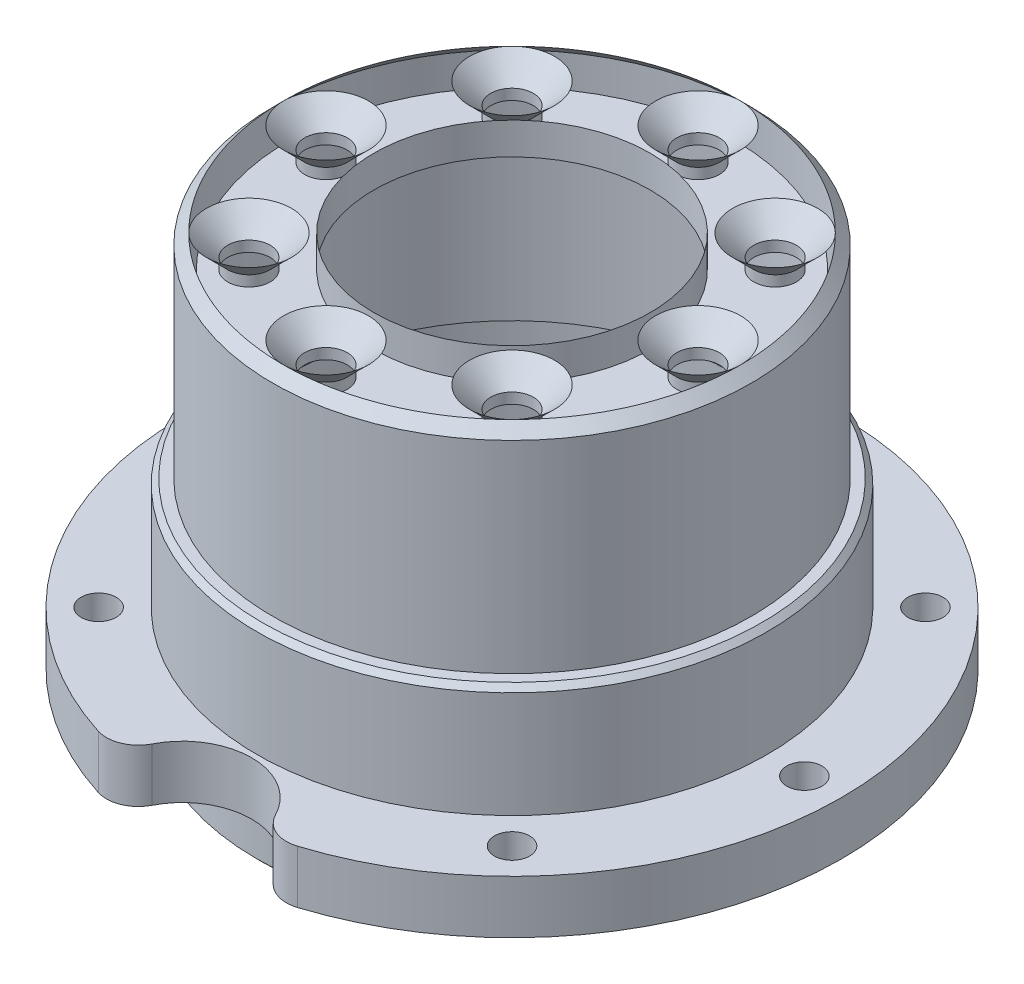
ISO-10303-21;
HEADER;
FILE_DESCRIPTION(('STEP AP214'),'2;1');
FILE_NAME('part.step','',(''),(''),'','','');
FILE_SCHEMA(('AUTOMOTIVE_DESIGN { 1 0 10303 214 1 1 1 1 }'));
ENDSEC;
DATA;
#1=APPLICATION_CONTEXT('core data for automotive mechanical design processes');
#2=APPLICATION_PROTOCOL_DEFINITION('international standard','automotive_design',2000,#1);
#3=PRODUCT_CONTEXT('',#1,'mechanical');
#4=PRODUCT('Part','Part','',(#3));
#5=PRODUCT_RELATED_PRODUCT_CATEGORY('part','',(#4));
#6=PRODUCT_DEFINITION_FORMATION('','',#4);
#7=PRODUCT_DEFINITION_CONTEXT('part definition',#1,'design');
#8=PRODUCT_DEFINITION('design','',#6,#7);
#9=PRODUCT_DEFINITION_SHAPE('','',#8);
#10=(LENGTH_UNIT() NAMED_UNIT(*) SI_UNIT(.MILLI.,.METRE.));
#11=(NAMED_UNIT(*) PLANE_ANGLE_UNIT() SI_UNIT($,.RADIAN.));
#12=(NAMED_UNIT(*) SI_UNIT($,.STERADIAN.) SOLID_ANGLE_UNIT());
#13=UNCERTAINTY_MEASURE_WITH_UNIT(LENGTH_MEASURE(1.E-05),#10,'distance_accuracy_value','');
#14=(GEOMETRIC_REPRESENTATION_CONTEXT(3) GLOBAL_UNCERTAINTY_ASSIGNED_CONTEXT((#13)) GLOBAL_UNIT_ASSIGNED_CONTEXT((#10,
#11,#12)) REPRESENTATION_CONTEXT('',''));
#15=CARTESIAN_POINT('',(0.,0.,0.));
#16=DIRECTION('',(0.,0.,1.));
#17=DIRECTION('',(1.,0.,0.));
#18=AXIS2_PLACEMENT_3D('',#15,#16,#17);
#19=CARTESIAN_POINT('',(-22.5,35.5,0.));
#20=DIRECTION('',(0.,-1.,0.));
#21=DIRECTION('',(0.,0.,-1.));
#22=AXIS2_PLACEMENT_3D('',#19,#20,#21);
#23=PLANE('',#22);
#24=CARTESIAN_POINT('',(0.,35.5,-17.5));
#25=DIRECTION('',(0.,1.,0.));
#26=DIRECTION('',(0.,0.,1.));
#27=AXIS2_PLACEMENT_3D('',#24,#25,#26);
#28=CIRCLE('',#27,4.);
#29=CARTESIAN_POINT('',(0.,35.5,-21.5));
#30=VERTEX_POINT('',#29);
#31=EDGE_CURVE('E111',#30,#30,#28,.T.);
#32=ORIENTED_EDGE('',*,*,#31,.F.);
#33=CARTESIAN_POINT('',(0.,35.5,0.));
#34=DIRECTION('',(0.,-1.,0.));
#35=DIRECTION('',(0.,0.,-1.));
#36=AXIS2_PLACEMENT_3D('',#33,#34,#35);
#37=CIRCLE('',#36,21.5);
#38=CARTESIAN_POINT('',(-15.2027957955108,35.5,-15.2027957955108));
#39=VERTEX_POINT('',#38);
#40=EDGE_CURVE('E293',#30,#39,#37,.F.);
#41=ORIENTED_EDGE('',*,*,#40,.T.);
#42=CARTESIAN_POINT('',(-12.3743686707646,35.5,-12.3743686707646));
#43=DIRECTION('',(0.,1.,0.));
#44=DIRECTION('',(0.,0.,1.));
#45=AXIS2_PLACEMENT_3D('',#42,#43,#44);
#46=CIRCLE('',#45,4.);
#47=EDGE_CURVE('E170',#39,#39,#46,.T.);
#48=ORIENTED_EDGE('',*,*,#47,.F.);
#49=CARTESIAN_POINT('',(0.,35.5,0.));
#50=DIRECTION('',(0.,-1.,0.));
#51=DIRECTION('',(0.,0.,-1.));
#52=AXIS2_PLACEMENT_3D('',#49,#50,#51);
#53=CIRCLE('',#52,21.5);
#54=CARTESIAN_POINT('',(-21.5,35.5,0.));
#55=VERTEX_POINT('',#54);
#56=EDGE_CURVE('E291',#39,#55,#53,.F.);
#57=ORIENTED_EDGE('',*,*,#56,.T.);
#58=CARTESIAN_POINT('',(-17.5,35.5,0.));
#59=DIRECTION('',(0.,1.,0.));
#60=DIRECTION('',(0.,0.,1.));
#61=AXIS2_PLACEMENT_3D('',#58,#59,#60);
#62=CIRCLE('',#61,4.);
#63=EDGE_CURVE('E163',#55,#55,#62,.T.);
#64=ORIENTED_EDGE('',*,*,#63,.F.);
#65=CARTESIAN_POINT('',(0.,35.5,0.));
#66=DIRECTION('',(0.,-1.,0.));
#67=DIRECTION('',(0.,0.,-1.));
#68=AXIS2_PLACEMENT_3D('',#65,#66,#67);
#69=CIRCLE('',#68,21.5);
#70=CARTESIAN_POINT('',(-15.2027957955108,35.5,15.2027957955108));
#71=VERTEX_POINT('',#70);
#72=EDGE_CURVE('E289',#55,#71,#69,.F.);
#73=ORIENTED_EDGE('',*,*,#72,.T.);
#74=CARTESIAN_POINT('',(-12.3743686707646,35.5,12.3743686707646));
#75=DIRECTION('',(0.,1.,0.));
#76=DIRECTION('',(0.,0.,1.));
#77=AXIS2_PLACEMENT_3D('',#74,#75,#76);
#78=CIRCLE('',#77,4.);
#79=EDGE_CURVE('E156',#71,#71,#78,.T.);
#80=ORIENTED_EDGE('',*,*,#79,.F.);
#81=CARTESIAN_POINT('',(0.,35.5,0.));
#82=DIRECTION('',(0.,-1.,0.));
#83=DIRECTION('',(0.,0.,-1.));
#84=AXIS2_PLACEMENT_3D('',#81,#82,#83);
#85=CIRCLE('',#84,21.5);
#86=CARTESIAN_POINT('',(0.,35.5,21.5));
#87=VERTEX_POINT('',#86);
#88=EDGE_CURVE('E287',#71,#87,#85,.F.);
#89=ORIENTED_EDGE('',*,*,#88,.T.);
#90=CARTESIAN_POINT('',(0.,35.5,17.5));
#91=DIRECTION('',(0.,1.,0.));
#92=DIRECTION('',(0.,0.,1.));
#93=AXIS2_PLACEMENT_3D('',#90,#91,#92);
#94=CIRCLE('',#93,4.);
#95=EDGE_CURVE('E149',#87,#87,#94,.T.);
#96=ORIENTED_EDGE('',*,*,#95,.F.);
#97=CARTESIAN_POINT('',(0.,35.5,0.));
#98=DIRECTION('',(0.,-1.,0.));
#99=DIRECTION('',(0.,0.,-1.));
#100=AXIS2_PLACEMENT_3D('',#97,#98,#99);
#101=CIRCLE('',#100,21.5);
#102=CARTESIAN_POINT('',(15.2027957955108,35.5,15.2027957955108));
#103=VERTEX_POINT('',#102);
#104=EDGE_CURVE('E285',#87,#103,#101,.F.);
#105=ORIENTED_EDGE('',*,*,#104,.T.);
#106=CARTESIAN_POINT('',(12.3743686707646,35.5,12.3743686707646));
#107=DIRECTION('',(0.,1.,0.));
#108=DIRECTION('',(0.,0.,1.));
#109=AXIS2_PLACEMENT_3D('',#106,#107,#108);
#110=CIRCLE('',#109,4.);
#111=EDGE_CURVE('E142',#103,#103,#110,.T.);
#112=ORIENTED_EDGE('',*,*,#111,.F.);
#113=CARTESIAN_POINT('',(0.,35.5,0.));
#114=DIRECTION('',(0.,-1.,0.));
#115=DIRECTION('',(0.,0.,-1.));
#116=AXIS2_PLACEMENT_3D('',#113,#114,#115);
#117=CIRCLE('',#116,21.5);
#118=CARTESIAN_POINT('',(21.5,35.5,0.));
#119=VERTEX_POINT('',#118);
#120=EDGE_CURVE('E283',#103,#119,#117,.F.);
#121=ORIENTED_EDGE('',*,*,#120,.T.);
#122=CARTESIAN_POINT('',(17.5,35.5,0.));
#123=DIRECTION('',(0.,1.,0.));
#124=DIRECTION('',(0.,0.,1.));
#125=AXIS2_PLACEMENT_3D('',#122,#123,#124);
#126=CIRCLE('',#125,4.);
#127=EDGE_CURVE('E135',#119,#119,#126,.T.);
#128=ORIENTED_EDGE('',*,*,#127,.F.);
#129=CARTESIAN_POINT('',(0.,35.5,0.));
#130=DIRECTION('',(0.,-1.,0.));
#131=DIRECTION('',(0.,0.,-1.));
#132=AXIS2_PLACEMENT_3D('',#129,#130,#131);
#133=CIRCLE('',#132,21.5);
#134=CARTESIAN_POINT('',(15.2027957955108,35.5,-15.2027957955108));
#135=VERTEX_POINT('',#134);
#136=EDGE_CURVE('E117',#119,#135,#133,.F.);
#137=ORIENTED_EDGE('',*,*,#136,.T.);
#138=CARTESIAN_POINT('',(12.3743686707646,35.5,-12.3743686707646));
#139=DIRECTION('',(0.,1.,0.));
#140=DIRECTION('',(0.,0.,1.));
#141=AXIS2_PLACEMENT_3D('',#138,#139,#140);
#142=CIRCLE('',#141,4.);
#143=EDGE_CURVE('E114',#135,#135,#142,.T.);
#144=ORIENTED_EDGE('',*,*,#143,.F.);
#145=CARTESIAN_POINT('',(0.,35.5,0.));
#146=DIRECTION('',(0.,-1.,0.));
#147=DIRECTION('',(0.,0.,-1.));
#148=AXIS2_PLACEMENT_3D('',#145,#146,#147);
#149=CIRCLE('',#148,21.5);
#150=EDGE_CURVE('E107',#135,#30,#149,.F.);
#151=ORIENTED_EDGE('',*,*,#150,.T.);
#152=EDGE_LOOP('',(#32,#41,#48,#57,#64,#73,#80,#89,#96,#105,#112,#121,#128,#137,#144,#151));
#153=FACE_BOUND('',#152,.T.);
#154=CARTESIAN_POINT('',(0.,35.5,0.));
#155=DIRECTION('',(0.,-1.,0.));
#156=DIRECTION('',(0.,0.,-1.));
#157=AXIS2_PLACEMENT_3D('',#154,#155,#156);
#158=CIRCLE('',#157,13.);
#159=CARTESIAN_POINT('',(0.,35.5,-13.));
#160=VERTEX_POINT('',#159);
#161=EDGE_CURVE('E243',#160,#160,#158,.T.);
#162=ORIENTED_EDGE('',*,*,#161,.T.);
#163=EDGE_LOOP('',(#162));
#164=FACE_BOUND('',#163,.T.);
#165=ADVANCED_FACE('F42',(#153,#164),#23,.F.);
#166=CARTESIAN_POINT('',(0.,0.,0.));
#167=DIRECTION('',(0.,-1.,0.));
#168=DIRECTION('',(0.,0.,-1.));
#169=AXIS2_PLACEMENT_3D('',#166,#167,#168);
#170=CYLINDRICAL_SURFACE('',#169,13.);
#171=ORIENTED_EDGE('',*,*,#161,.F.);
#172=EDGE_LOOP('',(#171));
#173=FACE_BOUND('',#172,.T.);
#174=CARTESIAN_POINT('',(0.,32.5,0.));
#175=DIRECTION('',(0.,-1.,0.));
#176=DIRECTION('',(0.,0.,-1.));
#177=AXIS2_PLACEMENT_3D('',#174,#175,#176);
#178=CIRCLE('',#177,13.);
#179=CARTESIAN_POINT('',(0.,32.5,-13.));
#180=VERTEX_POINT('',#179);
#181=EDGE_CURVE('E213',#180,#180,#178,.T.);
#182=ORIENTED_EDGE('',*,*,#181,.T.);
#183=EDGE_LOOP('',(#182));
#184=FACE_BOUND('',#183,.T.);
#185=ADVANCED_FACE('F335',(#173,#184),#170,.F.);
#186=CARTESIAN_POINT('',(0.,0.,0.));
#187=DIRECTION('',(0.,-1.,0.));
#188=DIRECTION('',(0.,0.,-1.));
#189=AXIS2_PLACEMENT_3D('',#186,#187,#188);
#190=CYLINDRICAL_SURFACE('',#189,22.5);
#191=CARTESIAN_POINT('',(0.,34.5,0.));
#192=DIRECTION('',(0.,-1.,0.));
#193=DIRECTION('',(0.,0.,-1.));
#194=AXIS2_PLACEMENT_3D('',#191,#192,#193);
#195=CIRCLE('',#194,22.5);
#196=CARTESIAN_POINT('',(0.,34.5,-22.5));
#197=VERTEX_POINT('',#196);
#198=EDGE_CURVE('E118',#197,#197,#195,.T.);
#199=ORIENTED_EDGE('',*,*,#198,.T.);
#200=EDGE_LOOP('',(#199));
#201=FACE_BOUND('',#200,.T.);
#202=CARTESIAN_POINT('',(0.,15.5,0.));
#203=DIRECTION('',(0.,-1.,0.));
#204=DIRECTION('',(0.,0.,-1.));
#205=AXIS2_PLACEMENT_3D('',#202,#203,#204);
#206=CIRCLE('',#205,22.5);
#207=CARTESIAN_POINT('',(0.,15.5,-22.5));
#208=VERTEX_POINT('',#207);
#209=EDGE_CURVE('E240',#208,#208,#206,.T.);
#210=ORIENTED_EDGE('',*,*,#209,.F.);
#211=EDGE_LOOP('',(#210));
#212=FACE_BOUND('',#211,.T.);
#213=ADVANCED_FACE('F340',(#201,#212),#190,.T.);
#214=CARTESIAN_POINT('',(-24.,15.5,0.));
#215=DIRECTION('',(0.,-1.,0.));
#216=DIRECTION('',(0.,0.,-1.));
#217=AXIS2_PLACEMENT_3D('',#214,#215,#216);
#218=PLANE('',#217);
#219=CARTESIAN_POINT('',(0.,15.5,0.));
#220=DIRECTION('',(0.,-1.,0.));
#221=DIRECTION('',(0.,0.,-1.));
#222=AXIS2_PLACEMENT_3D('',#219,#220,#221);
#223=CIRCLE('',#222,23.5);
#224=CARTESIAN_POINT('',(0.,15.5,-23.5));
#225=VERTEX_POINT('',#224);
#226=EDGE_CURVE('E277',#225,#225,#223,.F.);
#227=ORIENTED_EDGE('',*,*,#226,.T.);
#228=EDGE_LOOP('',(#227));
#229=FACE_BOUND('',#228,.T.);
#230=ORIENTED_EDGE('',*,*,#209,.T.);
#231=EDGE_LOOP('',(#230));
#232=FACE_BOUND('',#231,.T.);
#233=ADVANCED_FACE('F371',(#229,#232),#218,.F.);
#234=CARTESIAN_POINT('',(0.,0.,0.));
#235=DIRECTION('',(0.,-1.,0.));
#236=DIRECTION('',(0.,0.,-1.));
#237=AXIS2_PLACEMENT_3D('',#234,#235,#236);
#238=CYLINDRICAL_SURFACE('',#237,24.);
#239=CARTESIAN_POINT('',(0.,15.,0.));
#240=DIRECTION('',(0.,-1.,0.));
#241=DIRECTION('',(0.,0.,-1.));
#242=AXIS2_PLACEMENT_3D('',#239,#240,#241);
#243=CIRCLE('',#242,24.);
#244=CARTESIAN_POINT('',(0.,15.,-24.));
#245=VERTEX_POINT('',#244);
#246=EDGE_CURVE('E274',#245,#245,#243,.T.);
#247=ORIENTED_EDGE('',*,*,#246,.T.);
#248=EDGE_LOOP('',(#247));
#249=FACE_BOUND('',#248,.T.);
#250=CARTESIAN_POINT('',(0.,5.,0.));
#251=DIRECTION('',(0.,-1.,0.));
#252=DIRECTION('',(0.,0.,-1.));
#253=AXIS2_PLACEMENT_3D('',#250,#251,#252);
#254=CIRCLE('',#253,24.);
#255=CARTESIAN_POINT('',(0.,5.,-24.));
#256=VERTEX_POINT('',#255);
#257=EDGE_CURVE('E237',#256,#256,#254,.T.);
#258=ORIENTED_EDGE('',*,*,#257,.F.);
#259=EDGE_LOOP('',(#258));
#260=FACE_BOUND('',#259,.T.);
#261=ADVANCED_FACE('F375',(#249,#260),#238,.T.);
#262=CARTESIAN_POINT('',(-31.,5.,0.));
#263=DIRECTION('',(0.,-1.,0.));
#264=DIRECTION('',(0.,0.,-1.));
#265=AXIS2_PLACEMENT_3D('',#262,#263,#264);
#266=PLANE('',#265);
#267=CARTESIAN_POINT('',(-19.4454364826301,5.,-19.4454364826301));
#268=DIRECTION('',(0.,1.,0.));
#269=DIRECTION('',(0.,0.,1.));
#270=AXIS2_PLACEMENT_3D('',#267,#268,#269);
#271=CIRCLE('',#270,1.64999999999999);
#272=CARTESIAN_POINT('',(-19.4454364826301,5.,-17.7954364826301));
#273=VERTEX_POINT('',#272);
#274=EDGE_CURVE('E177',#273,#273,#271,.T.);
#275=ORIENTED_EDGE('',*,*,#274,.F.);
#276=EDGE_LOOP('',(#275));
#277=FACE_BOUND('',#276,.T.);
#278=CARTESIAN_POINT('',(0.,5.,-27.5));
#279=DIRECTION('',(0.,1.,0.));
#280=DIRECTION('',(0.,0.,1.));
#281=AXIS2_PLACEMENT_3D('',#278,#279,#280);
#282=CIRCLE('',#281,1.64999999999999);
#283=CARTESIAN_POINT('',(0.,5.,-25.85));
#284=VERTEX_POINT('',#283);
#285=EDGE_CURVE('E181',#284,#284,#282,.T.);
#286=ORIENTED_EDGE('',*,*,#285,.F.);
#287=EDGE_LOOP('',(#286));
#288=FACE_BOUND('',#287,.T.);
#289=CARTESIAN_POINT('',(19.4454364826301,5.,-19.4454364826301));
#290=DIRECTION('',(0.,1.,0.));
#291=DIRECTION('',(0.,0.,1.));
#292=AXIS2_PLACEMENT_3D('',#289,#290,#291);
#293=CIRCLE('',#292,1.64999999999999);
#294=CARTESIAN_POINT('',(19.4454364826301,5.,-17.7954364826301));
#295=VERTEX_POINT('',#294);
#296=EDGE_CURVE('E187',#295,#295,#293,.T.);
#297=ORIENTED_EDGE('',*,*,#296,.F.);
#298=EDGE_LOOP('',(#297));
#299=FACE_BOUND('',#298,.T.);
#300=CARTESIAN_POINT('',(27.5,5.,0.));
#301=DIRECTION('',(0.,1.,0.));
#302=DIRECTION('',(0.,0.,1.));
#303=AXIS2_PLACEMENT_3D('',#300,#301,#302);
#304=CIRCLE('',#303,1.64999999999999);
#305=CARTESIAN_POINT('',(27.5,5.,1.64999999999999));
#306=VERTEX_POINT('',#305);
#307=EDGE_CURVE('E191',#306,#306,#304,.T.);
#308=ORIENTED_EDGE('',*,*,#307,.F.);
#309=EDGE_LOOP('',(#308));
#310=FACE_BOUND('',#309,.T.);
#311=CARTESIAN_POINT('',(19.4454364826301,5.,19.4454364826301));
#312=DIRECTION('',(0.,1.,0.));
#313=DIRECTION('',(0.,0.,1.));
#314=AXIS2_PLACEMENT_3D('',#311,#312,#313);
#315=CIRCLE('',#314,1.64999999999999);
#316=CARTESIAN_POINT('',(19.4454364826301,5.,21.09543648263));
#317=VERTEX_POINT('',#316);
#318=EDGE_CURVE('E197',#317,#317,#315,.T.);
#319=ORIENTED_EDGE('',*,*,#318,.F.);
#320=EDGE_LOOP('',(#319));
#321=FACE_BOUND('',#320,.T.);
#322=CARTESIAN_POINT('',(-19.4454364826301,5.,19.4454364826301));
#323=DIRECTION('',(0.,1.,0.));
#324=DIRECTION('',(0.,0.,1.));
#325=AXIS2_PLACEMENT_3D('',#322,#323,#324);
#326=CIRCLE('',#325,1.64999999999999);
#327=CARTESIAN_POINT('',(-19.4454364826301,5.,21.09543648263));
#328=VERTEX_POINT('',#327);
#329=EDGE_CURVE('E203',#328,#328,#326,.T.);
#330=ORIENTED_EDGE('',*,*,#329,.F.);
#331=EDGE_LOOP('',(#330));
#332=FACE_BOUND('',#331,.T.);
#333=CARTESIAN_POINT('',(-27.5,5.,0.));
#334=DIRECTION('',(0.,1.,0.));
#335=DIRECTION('',(0.,0.,1.));
#336=AXIS2_PLACEMENT_3D('',#333,#334,#335);
#337=CIRCLE('',#336,1.64999999999999);
#338=CARTESIAN_POINT('',(-27.5,5.,1.64999999999999));
#339=VERTEX_POINT('',#338);
#340=EDGE_CURVE('E207',#339,#339,#337,.T.);
#341=ORIENTED_EDGE('',*,*,#340,.F.);
#342=EDGE_LOOP('',(#341));
#343=FACE_BOUND('',#342,.T.);
#344=CARTESIAN_POINT('',(0.,5.,31.));
#345=DIRECTION('',(0.,1.,0.));
#346=DIRECTION('',(0.,0.,1.));
#347=AXIS2_PLACEMENT_3D('',#344,#345,#346);
#348=CIRCLE('',#347,6.5);
#349=CARTESIAN_POINT('',(5.79238782325286,5.,28.0507215619694));
#350=VERTEX_POINT('',#349);
#351=CARTESIAN_POINT('',(-5.79238782325285,5.,28.0507215619694));
#352=VERTEX_POINT('',#351);
#353=EDGE_CURVE('E123',#350,#352,#348,.T.);
#354=ORIENTED_EDGE('',*,*,#353,.F.);
#355=CARTESIAN_POINT('',(8.4657975878311,5.,26.6895161290323));
#356=DIRECTION('',(0.,-1.,0.));
#357=DIRECTION('',(0.,0.,-1.));
#358=AXIS2_PLACEMENT_3D('',#355,#356,#357);
#359=CIRCLE('',#358,3.);
#360=CARTESIAN_POINT('',(9.37284732938443,5.,29.5491071428571));
#361=VERTEX_POINT('',#360);
#362=EDGE_CURVE('E11',#350,#361,#359,.F.);
#363=ORIENTED_EDGE('',*,*,#362,.T.);
#364=CARTESIAN_POINT('',(0.,5.,0.));
#365=DIRECTION('',(0.,-1.,0.));
#366=DIRECTION('',(0.,0.,-1.));
#367=AXIS2_PLACEMENT_3D('',#364,#365,#366);
#368=CIRCLE('',#367,31.);
#369=CARTESIAN_POINT('',(-9.37284732938443,5.,29.5491071428571));
#370=VERTEX_POINT('',#369);
#371=EDGE_CURVE('E234',#370,#361,#368,.T.);
#372=ORIENTED_EDGE('',*,*,#371,.F.);
#373=CARTESIAN_POINT('',(-8.4657975878311,5.,26.6895161290323));
#374=DIRECTION('',(0.,-1.,0.));
#375=DIRECTION('',(0.,0.,-1.));
#376=AXIS2_PLACEMENT_3D('',#373,#374,#375);
#377=CIRCLE('',#376,3.);
#378=EDGE_CURVE('E50',#370,#352,#377,.F.);
#379=ORIENTED_EDGE('',*,*,#378,.T.);
#380=EDGE_LOOP('',(#354,#363,#372,#379));
#381=FACE_BOUND('',#380,.T.);
#382=ORIENTED_EDGE('',*,*,#257,.T.);
#383=EDGE_LOOP('',(#382));
#384=FACE_BOUND('',#383,.T.);
#385=ADVANCED_FACE('F321',(#277,#288,#299,#310,#321,#332,#343,#381,#384),#266,.F.);
#386=CARTESIAN_POINT('',(0.,0.,0.));
#387=DIRECTION('',(0.,-1.,0.));
#388=DIRECTION('',(0.,0.,-1.));
#389=AXIS2_PLACEMENT_3D('',#386,#387,#388);
#390=CYLINDRICAL_SURFACE('',#389,31.);
#391=ORIENTED_EDGE('',*,*,#371,.T.);
#392=DIRECTION('',(0.,-1.,0.));
#393=VECTOR('',#392,1.);
#394=CARTESIAN_POINT('',(9.37284732938443,0.,29.5491071428571));
#395=LINE('',#394,#393);
#396=CARTESIAN_POINT('',(9.37284732938443,0.,29.5491071428571));
#397=VERTEX_POINT('',#396);
#398=EDGE_CURVE('E301',#361,#397,#395,.T.);
#399=ORIENTED_EDGE('',*,*,#398,.T.);
#400=CARTESIAN_POINT('',(0.,0.,0.));
#401=DIRECTION('',(0.,-1.,0.));
#402=DIRECTION('',(0.,0.,-1.));
#403=AXIS2_PLACEMENT_3D('',#400,#401,#402);
#404=CIRCLE('',#403,31.);
#405=CARTESIAN_POINT('',(-9.37284732938443,0.,29.5491071428571));
#406=VERTEX_POINT('',#405);
#407=EDGE_CURVE('E231',#406,#397,#404,.T.);
#408=ORIENTED_EDGE('',*,*,#407,.F.);
#409=DIRECTION('',(0.,-1.,0.));
#410=VECTOR('',#409,1.);
#411=CARTESIAN_POINT('',(-9.37284732938443,0.,29.5491071428571));
#412=LINE('',#411,#410);
#413=EDGE_CURVE('E298',#406,#370,#412,.F.);
#414=ORIENTED_EDGE('',*,*,#413,.T.);
#415=EDGE_LOOP('',(#391,#399,#408,#414));
#416=FACE_BOUND('',#415,.T.);
#417=ADVANCED_FACE('F319',(#416),#390,.T.);
#418=CARTESIAN_POINT('',(-31.,0.,0.));
#419=DIRECTION('',(0.,1.,0.));
#420=DIRECTION('',(0.,0.,1.));
#421=AXIS2_PLACEMENT_3D('',#418,#419,#420);
#422=PLANE('',#421);
#423=CARTESIAN_POINT('',(-19.4454364826301,0.,-19.4454364826301));
#424=DIRECTION('',(0.,1.,0.));
#425=DIRECTION('',(0.,0.,1.));
#426=AXIS2_PLACEMENT_3D('',#423,#424,#425);
#427=CIRCLE('',#426,1.64999999999999);
#428=CARTESIAN_POINT('',(-19.4454364826301,0.,-17.7954364826301));
#429=VERTEX_POINT('',#428);
#430=EDGE_CURVE('E180',#429,#429,#427,.T.);
#431=ORIENTED_EDGE('',*,*,#430,.T.);
#432=EDGE_LOOP('',(#431));
#433=FACE_BOUND('',#432,.T.);
#434=CARTESIAN_POINT('',(0.,0.,-27.5));
#435=DIRECTION('',(0.,1.,0.));
#436=DIRECTION('',(0.,0.,1.));
#437=AXIS2_PLACEMENT_3D('',#434,#435,#436);
#438=CIRCLE('',#437,1.64999999999999);
#439=CARTESIAN_POINT('',(0.,0.,-25.85));
#440=VERTEX_POINT('',#439);
#441=EDGE_CURVE('E184',#440,#440,#438,.T.);
#442=ORIENTED_EDGE('',*,*,#441,.T.);
#443=EDGE_LOOP('',(#442));
#444=FACE_BOUND('',#443,.T.);
#445=CARTESIAN_POINT('',(19.4454364826301,0.,-19.4454364826301));
#446=DIRECTION('',(0.,1.,0.));
#447=DIRECTION('',(0.,0.,1.));
#448=AXIS2_PLACEMENT_3D('',#445,#446,#447);
#449=CIRCLE('',#448,1.64999999999999);
#450=CARTESIAN_POINT('',(19.4454364826301,0.,-17.7954364826301));
#451=VERTEX_POINT('',#450);
#452=EDGE_CURVE('E190',#451,#451,#449,.T.);
#453=ORIENTED_EDGE('',*,*,#452,.T.);
#454=EDGE_LOOP('',(#453));
#455=FACE_BOUND('',#454,.T.);
#456=CARTESIAN_POINT('',(27.5,0.,0.));
#457=DIRECTION('',(0.,1.,0.));
#458=DIRECTION('',(0.,0.,1.));
#459=AXIS2_PLACEMENT_3D('',#456,#457,#458);
#460=CIRCLE('',#459,1.64999999999999);
#461=CARTESIAN_POINT('',(27.5,0.,1.64999999999999));
#462=VERTEX_POINT('',#461);
#463=EDGE_CURVE('E194',#462,#462,#460,.T.);
#464=ORIENTED_EDGE('',*,*,#463,.T.);
#465=EDGE_LOOP('',(#464));
#466=FACE_BOUND('',#465,.T.);
#467=CARTESIAN_POINT('',(19.4454364826301,0.,19.4454364826301));
#468=DIRECTION('',(0.,1.,0.));
#469=DIRECTION('',(0.,0.,1.));
#470=AXIS2_PLACEMENT_3D('',#467,#468,#469);
#471=CIRCLE('',#470,1.64999999999999);
#472=CARTESIAN_POINT('',(19.4454364826301,0.,21.09543648263));
#473=VERTEX_POINT('',#472);
#474=EDGE_CURVE('E200',#473,#473,#471,.T.);
#475=ORIENTED_EDGE('',*,*,#474,.T.);
#476=EDGE_LOOP('',(#475));
#477=FACE_BOUND('',#476,.T.);
#478=CARTESIAN_POINT('',(-19.4454364826301,0.,19.4454364826301));
#479=DIRECTION('',(0.,1.,0.));
#480=DIRECTION('',(0.,0.,1.));
#481=AXIS2_PLACEMENT_3D('',#478,#479,#480);
#482=CIRCLE('',#481,1.64999999999999);
#483=CARTESIAN_POINT('',(-19.4454364826301,0.,21.0954364826301));
#484=VERTEX_POINT('',#483);
#485=EDGE_CURVE('E206',#484,#484,#482,.T.);
#486=ORIENTED_EDGE('',*,*,#485,.T.);
#487=EDGE_LOOP('',(#486));
#488=FACE_BOUND('',#487,.T.);
#489=CARTESIAN_POINT('',(-27.5,0.,0.));
#490=DIRECTION('',(0.,1.,0.));
#491=DIRECTION('',(0.,0.,1.));
#492=AXIS2_PLACEMENT_3D('',#489,#490,#491);
#493=CIRCLE('',#492,1.64999999999999);
#494=CARTESIAN_POINT('',(-27.5,0.,1.64999999999999));
#495=VERTEX_POINT('',#494);
#496=EDGE_CURVE('E210',#495,#495,#493,.T.);
#497=ORIENTED_EDGE('',*,*,#496,.T.);
#498=EDGE_LOOP('',(#497));
#499=FACE_BOUND('',#498,.T.);
#500=CARTESIAN_POINT('',(0.,0.,0.));
#501=DIRECTION('',(0.,-1.,0.));
#502=DIRECTION('',(0.,0.,-1.));
#503=AXIS2_PLACEMENT_3D('',#500,#501,#502);
#504=CIRCLE('',#503,24.);
#505=CARTESIAN_POINT('',(0.,0.,-24.));
#506=VERTEX_POINT('',#505);
#507=EDGE_CURVE('E228',#506,#506,#504,.T.);
#508=ORIENTED_EDGE('',*,*,#507,.F.);
#509=EDGE_LOOP('',(#508));
#510=FACE_BOUND('',#509,.T.);
#511=ORIENTED_EDGE('',*,*,#407,.T.);
#512=CARTESIAN_POINT('',(8.4657975878311,0.,26.6895161290323));
#513=DIRECTION('',(0.,1.,0.));
#514=DIRECTION('',(0.,0.,1.));
#515=AXIS2_PLACEMENT_3D('',#512,#513,#514);
#516=CIRCLE('',#515,3.);
#517=CARTESIAN_POINT('',(5.79238782325286,0.,28.0507215619694));
#518=VERTEX_POINT('',#517);
#519=EDGE_CURVE('E306',#397,#518,#516,.F.);
#520=ORIENTED_EDGE('',*,*,#519,.T.);
#521=CARTESIAN_POINT('',(0.,0.,31.));
#522=DIRECTION('',(0.,1.,0.));
#523=DIRECTION('',(0.,0.,1.));
#524=AXIS2_PLACEMENT_3D('',#521,#522,#523);
#525=CIRCLE('',#524,6.5);
#526=CARTESIAN_POINT('',(-5.79238782325285,0.,28.0507215619694));
#527=VERTEX_POINT('',#526);
#528=EDGE_CURVE('E295',#518,#527,#525,.T.);
#529=ORIENTED_EDGE('',*,*,#528,.T.);
#530=CARTESIAN_POINT('',(-8.4657975878311,0.,26.6895161290323));
#531=DIRECTION('',(0.,1.,0.));
#532=DIRECTION('',(0.,0.,1.));
#533=AXIS2_PLACEMENT_3D('',#530,#531,#532);
#534=CIRCLE('',#533,3.);
#535=EDGE_CURVE('E304',#527,#406,#534,.F.);
#536=ORIENTED_EDGE('',*,*,#535,.T.);
#537=EDGE_LOOP('',(#511,#520,#529,#536));
#538=FACE_BOUND('',#537,.T.);
#539=ADVANCED_FACE('F315',(#433,#444,#455,#466,#477,#488,#499,#510,#538),#422,.F.);
#540=CARTESIAN_POINT('',(0.,0.,0.));
#541=DIRECTION('',(0.,-1.,0.));
#542=DIRECTION('',(0.,0.,-1.));
#543=AXIS2_PLACEMENT_3D('',#540,#541,#542);
#544=CYLINDRICAL_SURFACE('',#543,24.);
#545=CARTESIAN_POINT('',(0.,-3.49999999999999,0.));
#546=DIRECTION('',(0.,1.,0.));
#547=DIRECTION('',(0.,0.,1.));
#548=AXIS2_PLACEMENT_3D('',#545,#546,#547);
#549=CIRCLE('',#548,24.);
#550=CARTESIAN_POINT('',(0.,-3.49999999999999,24.));
#551=VERTEX_POINT('',#550);
#552=EDGE_CURVE('E271',#551,#551,#549,.T.);
#553=ORIENTED_EDGE('',*,*,#552,.T.);
#554=EDGE_LOOP('',(#553));
#555=FACE_BOUND('',#554,.T.);
#556=ORIENTED_EDGE('',*,*,#507,.T.);
#557=EDGE_LOOP('',(#556));
#558=FACE_BOUND('',#557,.T.);
#559=ADVANCED_FACE('F390',(#555,#558),#544,.T.);
#560=CARTESIAN_POINT('',(-24.,-4.,0.));
#561=DIRECTION('',(0.,1.,0.));
#562=DIRECTION('',(0.,0.,1.));
#563=AXIS2_PLACEMENT_3D('',#560,#561,#562);
#564=PLANE('',#563);
#565=CARTESIAN_POINT('',(0.,-4.,0.));
#566=DIRECTION('',(0.,1.,0.));
#567=DIRECTION('',(0.,0.,1.));
#568=AXIS2_PLACEMENT_3D('',#565,#566,#567);
#569=CIRCLE('',#568,23.5);
#570=CARTESIAN_POINT('',(0.,-4.,23.5));
#571=VERTEX_POINT('',#570);
#572=EDGE_CURVE('E246',#571,#571,#569,.F.);
#573=ORIENTED_EDGE('',*,*,#572,.T.);
#574=EDGE_LOOP('',(#573));
#575=FACE_BOUND('',#574,.T.);
#576=CARTESIAN_POINT('',(0.,-4.,0.));
#577=DIRECTION('',(0.,-1.,0.));
#578=DIRECTION('',(0.,0.,-1.));
#579=AXIS2_PLACEMENT_3D('',#576,#577,#578);
#580=CIRCLE('',#579,22.);
#581=CARTESIAN_POINT('',(0.,-4.,-22.));
#582=VERTEX_POINT('',#581);
#583=EDGE_CURVE('E225',#582,#582,#580,.T.);
#584=ORIENTED_EDGE('',*,*,#583,.F.);
#585=EDGE_LOOP('',(#584));
#586=FACE_BOUND('',#585,.T.);
#587=ADVANCED_FACE('F394',(#575,#586),#564,.F.);
#588=CARTESIAN_POINT('',(0.,0.,0.));
#589=DIRECTION('',(0.,-1.,0.));
#590=DIRECTION('',(0.,0.,-1.));
#591=AXIS2_PLACEMENT_3D('',#588,#589,#590);
#592=CYLINDRICAL_SURFACE('',#591,22.);
#593=CARTESIAN_POINT('',(0.,13.5,0.));
#594=DIRECTION('',(0.,-1.,0.));
#595=DIRECTION('',(0.,0.,-1.));
#596=AXIS2_PLACEMENT_3D('',#593,#594,#595);
#597=CIRCLE('',#596,22.);
#598=CARTESIAN_POINT('',(0.,13.5,-22.));
#599=VERTEX_POINT('',#598);
#600=EDGE_CURVE('E222',#599,#599,#597,.T.);
#601=ORIENTED_EDGE('',*,*,#600,.F.);
#602=EDGE_LOOP('',(#601));
#603=FACE_BOUND('',#602,.T.);
#604=ORIENTED_EDGE('',*,*,#583,.T.);
#605=EDGE_LOOP('',(#604));
#606=FACE_BOUND('',#605,.T.);
#607=ADVANCED_FACE('F398',(#603,#606),#592,.F.);
#608=CARTESIAN_POINT('',(-22.,13.5,0.));
#609=DIRECTION('',(0.,1.,0.));
#610=DIRECTION('',(0.,0.,1.));
#611=AXIS2_PLACEMENT_3D('',#608,#609,#610);
#612=PLANE('',#611);
#613=CARTESIAN_POINT('',(0.,13.5,0.));
#614=DIRECTION('',(0.,-1.,0.));
#615=DIRECTION('',(0.,0.,-1.));
#616=AXIS2_PLACEMENT_3D('',#613,#614,#615);
#617=CIRCLE('',#616,21.);
#618=CARTESIAN_POINT('',(0.,13.5,-21.));
#619=VERTEX_POINT('',#618);
#620=EDGE_CURVE('E219',#619,#619,#617,.T.);
#621=ORIENTED_EDGE('',*,*,#620,.F.);
#622=EDGE_LOOP('',(#621));
#623=FACE_BOUND('',#622,.T.);
#624=ORIENTED_EDGE('',*,*,#600,.T.);
#625=EDGE_LOOP('',(#624));
#626=FACE_BOUND('',#625,.T.);
#627=ADVANCED_FACE('F402',(#623,#626),#612,.F.);
#628=CARTESIAN_POINT('',(0.,0.,0.));
#629=DIRECTION('',(0.,-1.,0.));
#630=DIRECTION('',(0.,0.,-1.));
#631=AXIS2_PLACEMENT_3D('',#628,#629,#630);
#632=CYLINDRICAL_SURFACE('',#631,21.);
#633=CARTESIAN_POINT('',(0.,32.5,0.));
#634=DIRECTION('',(0.,-1.,0.));
#635=DIRECTION('',(0.,0.,-1.));
#636=AXIS2_PLACEMENT_3D('',#633,#634,#635);
#637=CIRCLE('',#636,21.);
#638=CARTESIAN_POINT('',(0.,32.5,-21.));
#639=VERTEX_POINT('',#638);
#640=EDGE_CURVE('E216',#639,#639,#637,.T.);
#641=ORIENTED_EDGE('',*,*,#640,.F.);
#642=EDGE_LOOP('',(#641));
#643=FACE_BOUND('',#642,.T.);
#644=ORIENTED_EDGE('',*,*,#620,.T.);
#645=EDGE_LOOP('',(#644));
#646=FACE_BOUND('',#645,.T.);
#647=ADVANCED_FACE('F406',(#643,#646),#632,.F.);
#648=CARTESIAN_POINT('',(-21.,32.5,0.));
#649=DIRECTION('',(0.,1.,0.));
#650=DIRECTION('',(0.,0.,1.));
#651=AXIS2_PLACEMENT_3D('',#648,#649,#650);
#652=PLANE('',#651);
#653=CARTESIAN_POINT('',(0.,32.5,-17.5));
#654=DIRECTION('',(0.,1.,0.));
#655=DIRECTION('',(0.,0.,1.));
#656=AXIS2_PLACEMENT_3D('',#653,#654,#655);
#657=CIRCLE('',#656,2.00000000000001);
#658=CARTESIAN_POINT('',(0.,32.5,-15.5));
#659=VERTEX_POINT('',#658);
#660=EDGE_CURVE('E126',#659,#659,#657,.T.);
#661=ORIENTED_EDGE('',*,*,#660,.T.);
#662=EDGE_LOOP('',(#661));
#663=FACE_BOUND('',#662,.T.);
#664=CARTESIAN_POINT('',(12.3743686707646,32.5,-12.3743686707646));
#665=DIRECTION('',(0.,1.,0.));
#666=DIRECTION('',(0.,0.,1.));
#667=AXIS2_PLACEMENT_3D('',#664,#665,#666);
#668=CIRCLE('',#667,2.00000000000001);
#669=CARTESIAN_POINT('',(12.3743686707646,32.5,-10.3743686707646));
#670=VERTEX_POINT('',#669);
#671=EDGE_CURVE('E134',#670,#670,#668,.T.);
#672=ORIENTED_EDGE('',*,*,#671,.T.);
#673=EDGE_LOOP('',(#672));
#674=FACE_BOUND('',#673,.T.);
#675=CARTESIAN_POINT('',(17.5,32.5,0.));
#676=DIRECTION('',(0.,1.,0.));
#677=DIRECTION('',(0.,0.,1.));
#678=AXIS2_PLACEMENT_3D('',#675,#676,#677);
#679=CIRCLE('',#678,2.00000000000001);
#680=CARTESIAN_POINT('',(17.5,32.5,2.));
#681=VERTEX_POINT('',#680);
#682=EDGE_CURVE('E141',#681,#681,#679,.T.);
#683=ORIENTED_EDGE('',*,*,#682,.T.);
#684=EDGE_LOOP('',(#683));
#685=FACE_BOUND('',#684,.T.);
#686=CARTESIAN_POINT('',(12.3743686707646,32.5,12.3743686707646));
#687=DIRECTION('',(0.,1.,0.));
#688=DIRECTION('',(0.,0.,1.));
#689=AXIS2_PLACEMENT_3D('',#686,#687,#688);
#690=CIRCLE('',#689,2.00000000000001);
#691=CARTESIAN_POINT('',(12.3743686707646,32.5,14.3743686707646));
#692=VERTEX_POINT('',#691);
#693=EDGE_CURVE('E148',#692,#692,#690,.T.);
#694=ORIENTED_EDGE('',*,*,#693,.T.);
#695=EDGE_LOOP('',(#694));
#696=FACE_BOUND('',#695,.T.);
#697=CARTESIAN_POINT('',(0.,32.5,17.5));
#698=DIRECTION('',(0.,1.,0.));
#699=DIRECTION('',(0.,0.,1.));
#700=AXIS2_PLACEMENT_3D('',#697,#698,#699);
#701=CIRCLE('',#700,2.00000000000001);
#702=CARTESIAN_POINT('',(0.,32.5,19.5));
#703=VERTEX_POINT('',#702);
#704=EDGE_CURVE('E155',#703,#703,#701,.T.);
#705=ORIENTED_EDGE('',*,*,#704,.T.);
#706=EDGE_LOOP('',(#705));
#707=FACE_BOUND('',#706,.T.);
#708=CARTESIAN_POINT('',(-12.3743686707646,32.5,12.3743686707646));
#709=DIRECTION('',(0.,1.,0.));
#710=DIRECTION('',(0.,0.,1.));
#711=AXIS2_PLACEMENT_3D('',#708,#709,#710);
#712=CIRCLE('',#711,2.00000000000001);
#713=CARTESIAN_POINT('',(-12.3743686707646,32.5,14.3743686707646));
#714=VERTEX_POINT('',#713);
#715=EDGE_CURVE('E162',#714,#714,#712,.T.);
#716=ORIENTED_EDGE('',*,*,#715,.T.);
#717=EDGE_LOOP('',(#716));
#718=FACE_BOUND('',#717,.T.);
#719=CARTESIAN_POINT('',(-17.5,32.5,0.));
#720=DIRECTION('',(0.,1.,0.));
#721=DIRECTION('',(0.,0.,1.));
#722=AXIS2_PLACEMENT_3D('',#719,#720,#721);
#723=CIRCLE('',#722,2.00000000000001);
#724=CARTESIAN_POINT('',(-17.5,32.5,2.00000000000001));
#725=VERTEX_POINT('',#724);
#726=EDGE_CURVE('E169',#725,#725,#723,.T.);
#727=ORIENTED_EDGE('',*,*,#726,.T.);
#728=EDGE_LOOP('',(#727));
#729=FACE_BOUND('',#728,.T.);
#730=CARTESIAN_POINT('',(-12.3743686707646,32.5,-12.3743686707646));
#731=DIRECTION('',(0.,1.,0.));
#732=DIRECTION('',(0.,0.,1.));
#733=AXIS2_PLACEMENT_3D('',#730,#731,#732);
#734=CIRCLE('',#733,2.00000000000001);
#735=CARTESIAN_POINT('',(-12.3743686707646,32.5,-10.3743686707646));
#736=VERTEX_POINT('',#735);
#737=EDGE_CURVE('E176',#736,#736,#734,.T.);
#738=ORIENTED_EDGE('',*,*,#737,.T.);
#739=EDGE_LOOP('',(#738));
#740=FACE_BOUND('',#739,.T.);
#741=ORIENTED_EDGE('',*,*,#181,.F.);
#742=EDGE_LOOP('',(#741));
#743=FACE_BOUND('',#742,.T.);
#744=ORIENTED_EDGE('',*,*,#640,.T.);
#745=EDGE_LOOP('',(#744));
#746=FACE_BOUND('',#745,.T.);
#747=ADVANCED_FACE('F410',(#663,#674,#685,#696,#707,#718,#729,#740,#743,#746),#652,.F.);
#748=CARTESIAN_POINT('',(-27.5,5.,0.));
#749=DIRECTION('',(0.,1.,0.));
#750=DIRECTION('',(0.,0.,1.));
#751=AXIS2_PLACEMENT_3D('',#748,#749,#750);
#752=CYLINDRICAL_SURFACE('',#751,1.64999999999999);
#753=ORIENTED_EDGE('',*,*,#340,.T.);
#754=EDGE_LOOP('',(#753));
#755=FACE_BOUND('',#754,.T.);
#756=ORIENTED_EDGE('',*,*,#496,.F.);
#757=EDGE_LOOP('',(#756));
#758=FACE_BOUND('',#757,.T.);
#759=ADVANCED_FACE('F414',(#755,#758),#752,.F.);
#760=CARTESIAN_POINT('',(-19.4454364826301,5.,19.4454364826301));
#761=DIRECTION('',(0.,1.,0.));
#762=DIRECTION('',(0.,0.,1.));
#763=AXIS2_PLACEMENT_3D('',#760,#761,#762);
#764=CYLINDRICAL_SURFACE('',#763,1.64999999999999);
#765=ORIENTED_EDGE('',*,*,#329,.T.);
#766=EDGE_LOOP('',(#765));
#767=FACE_BOUND('',#766,.T.);
#768=ORIENTED_EDGE('',*,*,#485,.F.);
#769=EDGE_LOOP('',(#768));
#770=FACE_BOUND('',#769,.T.);
#771=ADVANCED_FACE('F418',(#767,#770),#764,.F.);
#772=CARTESIAN_POINT('',(19.4454364826301,5.,19.4454364826301));
#773=DIRECTION('',(0.,1.,0.));
#774=DIRECTION('',(0.,0.,1.));
#775=AXIS2_PLACEMENT_3D('',#772,#773,#774);
#776=CYLINDRICAL_SURFACE('',#775,1.64999999999999);
#777=ORIENTED_EDGE('',*,*,#318,.T.);
#778=EDGE_LOOP('',(#777));
#779=FACE_BOUND('',#778,.T.);
#780=ORIENTED_EDGE('',*,*,#474,.F.);
#781=EDGE_LOOP('',(#780));
#782=FACE_BOUND('',#781,.T.);
#783=ADVANCED_FACE('F422',(#779,#782),#776,.F.);
#784=CARTESIAN_POINT('',(27.5,5.,0.));
#785=DIRECTION('',(0.,1.,0.));
#786=DIRECTION('',(0.,0.,1.));
#787=AXIS2_PLACEMENT_3D('',#784,#785,#786);
#788=CYLINDRICAL_SURFACE('',#787,1.64999999999999);
#789=ORIENTED_EDGE('',*,*,#307,.T.);
#790=EDGE_LOOP('',(#789));
#791=FACE_BOUND('',#790,.T.);
#792=ORIENTED_EDGE('',*,*,#463,.F.);
#793=EDGE_LOOP('',(#792));
#794=FACE_BOUND('',#793,.T.);
#795=ADVANCED_FACE('F426',(#791,#794),#788,.F.);
#796=CARTESIAN_POINT('',(19.4454364826301,5.,-19.4454364826301));
#797=DIRECTION('',(0.,1.,0.));
#798=DIRECTION('',(0.,0.,1.));
#799=AXIS2_PLACEMENT_3D('',#796,#797,#798);
#800=CYLINDRICAL_SURFACE('',#799,1.64999999999999);
#801=ORIENTED_EDGE('',*,*,#296,.T.);
#802=EDGE_LOOP('',(#801));
#803=FACE_BOUND('',#802,.T.);
#804=ORIENTED_EDGE('',*,*,#452,.F.);
#805=EDGE_LOOP('',(#804));
#806=FACE_BOUND('',#805,.T.);
#807=ADVANCED_FACE('F430',(#803,#806),#800,.F.);
#808=CARTESIAN_POINT('',(0.,5.,-27.5));
#809=DIRECTION('',(0.,1.,0.));
#810=DIRECTION('',(0.,0.,1.));
#811=AXIS2_PLACEMENT_3D('',#808,#809,#810);
#812=CYLINDRICAL_SURFACE('',#811,1.64999999999999);
#813=ORIENTED_EDGE('',*,*,#285,.T.);
#814=EDGE_LOOP('',(#813));
#815=FACE_BOUND('',#814,.T.);
#816=ORIENTED_EDGE('',*,*,#441,.F.);
#817=EDGE_LOOP('',(#816));
#818=FACE_BOUND('',#817,.T.);
#819=ADVANCED_FACE('F434',(#815,#818),#812,.F.);
#820=CARTESIAN_POINT('',(-19.4454364826301,5.,-19.4454364826301));
#821=DIRECTION('',(0.,1.,0.));
#822=DIRECTION('',(0.,0.,1.));
#823=AXIS2_PLACEMENT_3D('',#820,#821,#822);
#824=CYLINDRICAL_SURFACE('',#823,1.64999999999999);
#825=ORIENTED_EDGE('',*,*,#274,.T.);
#826=EDGE_LOOP('',(#825));
#827=FACE_BOUND('',#826,.T.);
#828=ORIENTED_EDGE('',*,*,#430,.F.);
#829=EDGE_LOOP('',(#828));
#830=FACE_BOUND('',#829,.T.);
#831=ADVANCED_FACE('F438',(#827,#830),#824,.F.);
#832=CARTESIAN_POINT('',(-12.3743686707646,35.5,-12.3743686707646));
#833=DIRECTION('',(0.,1.,0.));
#834=DIRECTION('',(0.,0.,1.));
#835=AXIS2_PLACEMENT_3D('',#832,#833,#834);
#836=CYLINDRICAL_SURFACE('',#835,2.00000000000001);
#837=CARTESIAN_POINT('',(-12.3743686707646,33.5,-12.3743686707646));
#838=DIRECTION('',(0.,1.,0.));
#839=DIRECTION('',(0.,0.,1.));
#840=AXIS2_PLACEMENT_3D('',#837,#838,#839);
#841=CIRCLE('',#840,2.00000000000001);
#842=CARTESIAN_POINT('',(-12.3743686707646,33.5,-10.3743686707646));
#843=VERTEX_POINT('',#842);
#844=EDGE_CURVE('E173',#843,#843,#841,.T.);
#845=ORIENTED_EDGE('',*,*,#844,.T.);
#846=EDGE_LOOP('',(#845));
#847=FACE_BOUND('',#846,.T.);
#848=ORIENTED_EDGE('',*,*,#737,.F.);
#849=EDGE_LOOP('',(#848));
#850=FACE_BOUND('',#849,.T.);
#851=ADVANCED_FACE('F442',(#847,#850),#836,.F.);
#852=CARTESIAN_POINT('',(-12.3743686707646,35.5,-12.3743686707646));
#853=DIRECTION('',(0.,1.,0.));
#854=DIRECTION('',(0.,0.,1.));
#855=AXIS2_PLACEMENT_3D('',#852,#853,#854);
#856=CONICAL_SURFACE('',#855,4.,0.785398163397445);
#857=ORIENTED_EDGE('',*,*,#844,.F.);
#858=EDGE_LOOP('',(#857));
#859=FACE_BOUND('',#858,.T.);
#860=ORIENTED_EDGE('',*,*,#47,.T.);
#861=EDGE_LOOP('',(#860));
#862=FACE_BOUND('',#861,.T.);
#863=ADVANCED_FACE('F446',(#859,#862),#856,.F.);
#864=CARTESIAN_POINT('',(-17.5,35.5,0.));
#865=DIRECTION('',(0.,1.,0.));
#866=DIRECTION('',(0.,0.,1.));
#867=AXIS2_PLACEMENT_3D('',#864,#865,#866);
#868=CYLINDRICAL_SURFACE('',#867,2.00000000000001);
#869=CARTESIAN_POINT('',(-17.5,33.5,0.));
#870=DIRECTION('',(0.,1.,0.));
#871=DIRECTION('',(0.,0.,1.));
#872=AXIS2_PLACEMENT_3D('',#869,#870,#871);
#873=CIRCLE('',#872,2.00000000000001);
#874=CARTESIAN_POINT('',(-17.5,33.5,2.00000000000002));
#875=VERTEX_POINT('',#874);
#876=EDGE_CURVE('E166',#875,#875,#873,.T.);
#877=ORIENTED_EDGE('',*,*,#876,.T.);
#878=EDGE_LOOP('',(#877));
#879=FACE_BOUND('',#878,.T.);
#880=ORIENTED_EDGE('',*,*,#726,.F.);
#881=EDGE_LOOP('',(#880));
#882=FACE_BOUND('',#881,.T.);
#883=ADVANCED_FACE('F450',(#879,#882),#868,.F.);
#884=CARTESIAN_POINT('',(-17.5,35.5,0.));
#885=DIRECTION('',(0.,1.,0.));
#886=DIRECTION('',(0.,0.,1.));
#887=AXIS2_PLACEMENT_3D('',#884,#885,#886);
#888=CONICAL_SURFACE('',#887,4.,0.785398163397445);
#889=ORIENTED_EDGE('',*,*,#876,.F.);
#890=EDGE_LOOP('',(#889));
#891=FACE_BOUND('',#890,.T.);
#892=ORIENTED_EDGE('',*,*,#63,.T.);
#893=EDGE_LOOP('',(#892));
#894=FACE_BOUND('',#893,.T.);
#895=ADVANCED_FACE('F454',(#891,#894),#888,.F.);
#896=CARTESIAN_POINT('',(-12.3743686707646,35.5,12.3743686707646));
#897=DIRECTION('',(0.,1.,0.));
#898=DIRECTION('',(0.,0.,1.));
#899=AXIS2_PLACEMENT_3D('',#896,#897,#898);
#900=CYLINDRICAL_SURFACE('',#899,2.00000000000001);
#901=CARTESIAN_POINT('',(-12.3743686707646,33.5,12.3743686707646));
#902=DIRECTION('',(0.,1.,0.));
#903=DIRECTION('',(0.,0.,1.));
#904=AXIS2_PLACEMENT_3D('',#901,#902,#903);
#905=CIRCLE('',#904,2.00000000000001);
#906=CARTESIAN_POINT('',(-12.3743686707646,33.5,14.3743686707646));
#907=VERTEX_POINT('',#906);
#908=EDGE_CURVE('E159',#907,#907,#905,.T.);
#909=ORIENTED_EDGE('',*,*,#908,.T.);
#910=EDGE_LOOP('',(#909));
#911=FACE_BOUND('',#910,.T.);
#912=ORIENTED_EDGE('',*,*,#715,.F.);
#913=EDGE_LOOP('',(#912));
#914=FACE_BOUND('',#913,.T.);
#915=ADVANCED_FACE('F458',(#911,#914),#900,.F.);
#916=CARTESIAN_POINT('',(-12.3743686707646,35.5,12.3743686707646));
#917=DIRECTION('',(0.,1.,0.));
#918=DIRECTION('',(0.,0.,1.));
#919=AXIS2_PLACEMENT_3D('',#916,#917,#918);
#920=CONICAL_SURFACE('',#919,4.,0.785398163397445);
#921=ORIENTED_EDGE('',*,*,#908,.F.);
#922=EDGE_LOOP('',(#921));
#923=FACE_BOUND('',#922,.T.);
#924=ORIENTED_EDGE('',*,*,#79,.T.);
#925=EDGE_LOOP('',(#924));
#926=FACE_BOUND('',#925,.T.);
#927=ADVANCED_FACE('F462',(#923,#926),#920,.F.);
#928=CARTESIAN_POINT('',(0.,35.5,17.5));
#929=DIRECTION('',(0.,1.,0.));
#930=DIRECTION('',(0.,0.,1.));
#931=AXIS2_PLACEMENT_3D('',#928,#929,#930);
#932=CYLINDRICAL_SURFACE('',#931,2.00000000000001);
#933=CARTESIAN_POINT('',(0.,33.5,17.5));
#934=DIRECTION('',(0.,1.,0.));
#935=DIRECTION('',(0.,0.,1.));
#936=AXIS2_PLACEMENT_3D('',#933,#934,#935);
#937=CIRCLE('',#936,2.00000000000001);
#938=CARTESIAN_POINT('',(0.,33.5,19.5));
#939=VERTEX_POINT('',#938);
#940=EDGE_CURVE('E152',#939,#939,#937,.T.);
#941=ORIENTED_EDGE('',*,*,#940,.T.);
#942=EDGE_LOOP('',(#941));
#943=FACE_BOUND('',#942,.T.);
#944=ORIENTED_EDGE('',*,*,#704,.F.);
#945=EDGE_LOOP('',(#944));
#946=FACE_BOUND('',#945,.T.);
#947=ADVANCED_FACE('F466',(#943,#946),#932,.F.);
#948=CARTESIAN_POINT('',(0.,35.5,17.5));
#949=DIRECTION('',(0.,1.,0.));
#950=DIRECTION('',(0.,0.,1.));
#951=AXIS2_PLACEMENT_3D('',#948,#949,#950);
#952=CONICAL_SURFACE('',#951,4.,0.785398163397445);
#953=ORIENTED_EDGE('',*,*,#940,.F.);
#954=EDGE_LOOP('',(#953));
#955=FACE_BOUND('',#954,.T.);
#956=ORIENTED_EDGE('',*,*,#95,.T.);
#957=EDGE_LOOP('',(#956));
#958=FACE_BOUND('',#957,.T.);
#959=ADVANCED_FACE('F470',(#955,#958),#952,.F.);
#960=CARTESIAN_POINT('',(12.3743686707646,35.5,12.3743686707646));
#961=DIRECTION('',(0.,1.,0.));
#962=DIRECTION('',(0.,0.,1.));
#963=AXIS2_PLACEMENT_3D('',#960,#961,#962);
#964=CYLINDRICAL_SURFACE('',#963,2.00000000000001);
#965=CARTESIAN_POINT('',(12.3743686707646,33.5,12.3743686707646));
#966=DIRECTION('',(0.,1.,0.));
#967=DIRECTION('',(0.,0.,1.));
#968=AXIS2_PLACEMENT_3D('',#965,#966,#967);
#969=CIRCLE('',#968,2.00000000000001);
#970=CARTESIAN_POINT('',(12.3743686707646,33.5,14.3743686707646));
#971=VERTEX_POINT('',#970);
#972=EDGE_CURVE('E145',#971,#971,#969,.T.);
#973=ORIENTED_EDGE('',*,*,#972,.T.);
#974=EDGE_LOOP('',(#973));
#975=FACE_BOUND('',#974,.T.);
#976=ORIENTED_EDGE('',*,*,#693,.F.);
#977=EDGE_LOOP('',(#976));
#978=FACE_BOUND('',#977,.T.);
#979=ADVANCED_FACE('F474',(#975,#978),#964,.F.);
#980=CARTESIAN_POINT('',(12.3743686707646,35.5,12.3743686707646));
#981=DIRECTION('',(0.,1.,0.));
#982=DIRECTION('',(0.,0.,1.));
#983=AXIS2_PLACEMENT_3D('',#980,#981,#982);
#984=CONICAL_SURFACE('',#983,4.,0.785398163397445);
#985=ORIENTED_EDGE('',*,*,#972,.F.);
#986=EDGE_LOOP('',(#985));
#987=FACE_BOUND('',#986,.T.);
#988=ORIENTED_EDGE('',*,*,#111,.T.);
#989=EDGE_LOOP('',(#988));
#990=FACE_BOUND('',#989,.T.);
#991=ADVANCED_FACE('F478',(#987,#990),#984,.F.);
#992=CARTESIAN_POINT('',(17.5,35.5,0.));
#993=DIRECTION('',(0.,1.,0.));
#994=DIRECTION('',(0.,0.,1.));
#995=AXIS2_PLACEMENT_3D('',#992,#993,#994);
#996=CYLINDRICAL_SURFACE('',#995,2.00000000000001);
#997=CARTESIAN_POINT('',(17.5,33.5,0.));
#998=DIRECTION('',(0.,1.,0.));
#999=DIRECTION('',(0.,0.,1.));
#1000=AXIS2_PLACEMENT_3D('',#997,#998,#999);
#1001=CIRCLE('',#1000,2.00000000000001);
#1002=CARTESIAN_POINT('',(17.5,33.5,2.00000000000001));
#1003=VERTEX_POINT('',#1002);
#1004=EDGE_CURVE('E138',#1003,#1003,#1001,.T.);
#1005=ORIENTED_EDGE('',*,*,#1004,.T.);
#1006=EDGE_LOOP('',(#1005));
#1007=FACE_BOUND('',#1006,.T.);
#1008=ORIENTED_EDGE('',*,*,#682,.F.);
#1009=EDGE_LOOP('',(#1008));
#1010=FACE_BOUND('',#1009,.T.);
#1011=ADVANCED_FACE('F482',(#1007,#1010),#996,.F.);
#1012=CARTESIAN_POINT('',(17.5,35.5,0.));
#1013=DIRECTION('',(0.,1.,0.));
#1014=DIRECTION('',(0.,0.,1.));
#1015=AXIS2_PLACEMENT_3D('',#1012,#1013,#1014);
#1016=CONICAL_SURFACE('',#1015,4.,0.785398163397445);
#1017=ORIENTED_EDGE('',*,*,#1004,.F.);
#1018=EDGE_LOOP('',(#1017));
#1019=FACE_BOUND('',#1018,.T.);
#1020=ORIENTED_EDGE('',*,*,#127,.T.);
#1021=EDGE_LOOP('',(#1020));
#1022=FACE_BOUND('',#1021,.T.);
#1023=ADVANCED_FACE('F486',(#1019,#1022),#1016,.F.);
#1024=CARTESIAN_POINT('',(12.3743686707646,35.5,-12.3743686707646));
#1025=DIRECTION('',(0.,1.,0.));
#1026=DIRECTION('',(0.,0.,1.));
#1027=AXIS2_PLACEMENT_3D('',#1024,#1025,#1026);
#1028=CYLINDRICAL_SURFACE('',#1027,2.00000000000001);
#1029=CARTESIAN_POINT('',(12.3743686707646,33.5,-12.3743686707646));
#1030=DIRECTION('',(0.,1.,0.));
#1031=DIRECTION('',(0.,0.,1.));
#1032=AXIS2_PLACEMENT_3D('',#1029,#1030,#1031);
#1033=CIRCLE('',#1032,2.00000000000001);
#1034=CARTESIAN_POINT('',(12.3743686707646,33.5,-10.3743686707646));
#1035=VERTEX_POINT('',#1034);
#1036=EDGE_CURVE('E131',#1035,#1035,#1033,.T.);
#1037=ORIENTED_EDGE('',*,*,#1036,.T.);
#1038=EDGE_LOOP('',(#1037));
#1039=FACE_BOUND('',#1038,.T.);
#1040=ORIENTED_EDGE('',*,*,#671,.F.);
#1041=EDGE_LOOP('',(#1040));
#1042=FACE_BOUND('',#1041,.T.);
#1043=ADVANCED_FACE('F490',(#1039,#1042),#1028,.F.);
#1044=CARTESIAN_POINT('',(12.3743686707646,35.5,-12.3743686707646));
#1045=DIRECTION('',(0.,1.,0.));
#1046=DIRECTION('',(0.,0.,1.));
#1047=AXIS2_PLACEMENT_3D('',#1044,#1045,#1046);
#1048=CONICAL_SURFACE('',#1047,4.,0.785398163397445);
#1049=ORIENTED_EDGE('',*,*,#1036,.F.);
#1050=EDGE_LOOP('',(#1049));
#1051=FACE_BOUND('',#1050,.T.);
#1052=ORIENTED_EDGE('',*,*,#143,.T.);
#1053=EDGE_LOOP('',(#1052));
#1054=FACE_BOUND('',#1053,.T.);
#1055=ADVANCED_FACE('F494',(#1051,#1054),#1048,.F.);
#1056=CARTESIAN_POINT('',(0.,35.5,-17.5));
#1057=DIRECTION('',(0.,1.,0.));
#1058=DIRECTION('',(0.,0.,1.));
#1059=AXIS2_PLACEMENT_3D('',#1056,#1057,#1058);
#1060=CYLINDRICAL_SURFACE('',#1059,2.00000000000001);
#1061=CARTESIAN_POINT('',(0.,33.5,-17.5));
#1062=DIRECTION('',(0.,1.,0.));
#1063=DIRECTION('',(0.,0.,1.));
#1064=AXIS2_PLACEMENT_3D('',#1061,#1062,#1063);
#1065=CIRCLE('',#1064,2.00000000000001);
#1066=CARTESIAN_POINT('',(0.,33.5,-15.5));
#1067=VERTEX_POINT('',#1066);
#1068=EDGE_CURVE('E122',#1067,#1067,#1065,.T.);
#1069=ORIENTED_EDGE('',*,*,#1068,.T.);
#1070=EDGE_LOOP('',(#1069));
#1071=FACE_BOUND('',#1070,.T.);
#1072=ORIENTED_EDGE('',*,*,#660,.F.);
#1073=EDGE_LOOP('',(#1072));
#1074=FACE_BOUND('',#1073,.T.);
#1075=ADVANCED_FACE('F498',(#1071,#1074),#1060,.F.);
#1076=CARTESIAN_POINT('',(0.,35.5,-17.5));
#1077=DIRECTION('',(0.,1.,0.));
#1078=DIRECTION('',(0.,0.,1.));
#1079=AXIS2_PLACEMENT_3D('',#1076,#1077,#1078);
#1080=CONICAL_SURFACE('',#1079,4.,0.785398163397445);
#1081=ORIENTED_EDGE('',*,*,#1068,.F.);
#1082=EDGE_LOOP('',(#1081));
#1083=FACE_BOUND('',#1082,.T.);
#1084=ORIENTED_EDGE('',*,*,#31,.T.);
#1085=EDGE_LOOP('',(#1084));
#1086=FACE_BOUND('',#1085,.T.);
#1087=ADVANCED_FACE('F121',(#1083,#1086),#1080,.F.);
#1088=CARTESIAN_POINT('',(0.,-4.,0.));
#1089=DIRECTION('',(0.,1.,0.));
#1090=DIRECTION('',(0.,0.,1.));
#1091=AXIS2_PLACEMENT_3D('',#1088,#1089,#1090);
#1092=CONICAL_SURFACE('',#1091,23.5,0.785398163397448);
#1093=ORIENTED_EDGE('',*,*,#552,.F.);
#1094=EDGE_LOOP('',(#1093));
#1095=FACE_BOUND('',#1094,.T.);
#1096=ORIENTED_EDGE('',*,*,#572,.F.);
#1097=EDGE_LOOP('',(#1096));
#1098=FACE_BOUND('',#1097,.T.);
#1099=ADVANCED_FACE('F347',(#1095,#1098),#1092,.T.);
#1100=CARTESIAN_POINT('',(0.,15.,0.));
#1101=DIRECTION('',(0.,-1.,0.));
#1102=DIRECTION('',(0.,0.,-1.));
#1103=AXIS2_PLACEMENT_3D('',#1100,#1101,#1102);
#1104=CONICAL_SURFACE('',#1103,24.,0.785398163397452);
#1105=ORIENTED_EDGE('',*,*,#226,.F.);
#1106=EDGE_LOOP('',(#1105));
#1107=FACE_BOUND('',#1106,.T.);
#1108=ORIENTED_EDGE('',*,*,#246,.F.);
#1109=EDGE_LOOP('',(#1108));
#1110=FACE_BOUND('',#1109,.T.);
#1111=ADVANCED_FACE('F353',(#1107,#1110),#1104,.T.);
#1112=CARTESIAN_POINT('',(0.,34.5,0.));
#1113=DIRECTION('',(0.,-1.,0.));
#1114=DIRECTION('',(0.,0.,-1.));
#1115=AXIS2_PLACEMENT_3D('',#1112,#1113,#1114);
#1116=CONICAL_SURFACE('',#1115,22.5,0.785398163397452);
#1117=ORIENTED_EDGE('',*,*,#56,.F.);
#1118=ORIENTED_EDGE('',*,*,#40,.F.);
#1119=ORIENTED_EDGE('',*,*,#150,.F.);
#1120=ORIENTED_EDGE('',*,*,#136,.F.);
#1121=ORIENTED_EDGE('',*,*,#120,.F.);
#1122=ORIENTED_EDGE('',*,*,#104,.F.);
#1123=ORIENTED_EDGE('',*,*,#88,.F.);
#1124=ORIENTED_EDGE('',*,*,#72,.F.);
#1125=EDGE_LOOP('',(#1117,#1118,#1119,#1120,#1121,#1122,#1123,#1124));
#1126=FACE_BOUND('',#1125,.T.);
#1127=ORIENTED_EDGE('',*,*,#198,.F.);
#1128=EDGE_LOOP('',(#1127));
#1129=FACE_BOUND('',#1128,.T.);
#1130=ADVANCED_FACE('F331',(#1126,#1129),#1116,.T.);
#1131=CARTESIAN_POINT('',(0.,-4.,31.));
#1132=DIRECTION('',(0.,1.,0.));
#1133=DIRECTION('',(0.,0.,1.));
#1134=AXIS2_PLACEMENT_3D('',#1131,#1132,#1133);
#1135=CYLINDRICAL_SURFACE('',#1134,6.5);
#1136=ORIENTED_EDGE('',*,*,#528,.F.);
#1137=DIRECTION('',(0.,1.,0.));
#1138=VECTOR('',#1137,1.);
#1139=CARTESIAN_POINT('',(5.79238782325286,-4.,28.0507215619694));
#1140=LINE('',#1139,#1138);
#1141=EDGE_CURVE('E63',#518,#350,#1140,.T.);
#1142=ORIENTED_EDGE('',*,*,#1141,.T.);
#1143=ORIENTED_EDGE('',*,*,#353,.T.);
#1144=DIRECTION('',(0.,1.,0.));
#1145=VECTOR('',#1144,1.);
#1146=CARTESIAN_POINT('',(-5.79238782325285,-4.,28.0507215619694));
#1147=LINE('',#1146,#1145);
#1148=EDGE_CURVE('E308',#352,#527,#1147,.F.);
#1149=ORIENTED_EDGE('',*,*,#1148,.T.);
#1150=EDGE_LOOP('',(#1136,#1142,#1143,#1149));
#1151=FACE_BOUND('',#1150,.T.);
#1152=ADVANCED_FACE('F311',(#1151),#1135,.F.);
#1153=CARTESIAN_POINT('',(8.4657975878311,-4.,26.6895161290323));
#1154=DIRECTION('',(0.,1.,0.));
#1155=DIRECTION('',(0.,0.,1.));
#1156=AXIS2_PLACEMENT_3D('',#1153,#1154,#1155);
#1157=CYLINDRICAL_SURFACE('',#1156,3.);
#1158=ORIENTED_EDGE('',*,*,#362,.F.);
#1159=ORIENTED_EDGE('',*,*,#1141,.F.);
#1160=ORIENTED_EDGE('',*,*,#519,.F.);
#1161=ORIENTED_EDGE('',*,*,#398,.F.);
#1162=EDGE_LOOP('',(#1158,#1159,#1160,#1161));
#1163=FACE_BOUND('',#1162,.T.);
#1164=ADVANCED_FACE('F325',(#1163),#1157,.T.);
#1165=CARTESIAN_POINT('',(-8.4657975878311,-4.,26.6895161290323));
#1166=DIRECTION('',(0.,-1.,0.));
#1167=DIRECTION('',(0.,0.,-1.));
#1168=AXIS2_PLACEMENT_3D('',#1165,#1166,#1167);
#1169=CYLINDRICAL_SURFACE('',#1168,3.);
#1170=ORIENTED_EDGE('',*,*,#535,.F.);
#1171=ORIENTED_EDGE('',*,*,#1148,.F.);
#1172=ORIENTED_EDGE('',*,*,#378,.F.);
#1173=ORIENTED_EDGE('',*,*,#413,.F.);
#1174=EDGE_LOOP('',(#1170,#1171,#1172,#1173));
#1175=FACE_BOUND('',#1174,.T.);
#1176=ADVANCED_FACE('F44',(#1175),#1169,.T.);
#1177=CLOSED_SHELL('',(#165,#185,#213,#233,#261,#385,#417,#539,#559,#587,#607,#627,#647,#747,
#759,#771,#783,#795,#807,#819,#831,#851,#863,#883,#895,#915,#927,#947,#959,#979,#991,#1011,
#1023,#1043,#1055,#1075,#1087,#1099,#1111,#1130,#1152,#1164,#1176));
#1178=MANIFOLD_SOLID_BREP('B2',#1177);
#1179=ADVANCED_BREP_SHAPE_REPRESENTATION('',(#18,#1178),#14);
#1180=SHAPE_DEFINITION_REPRESENTATION(#9,#1179);
ENDSEC;
END-ISO-10303-21;
